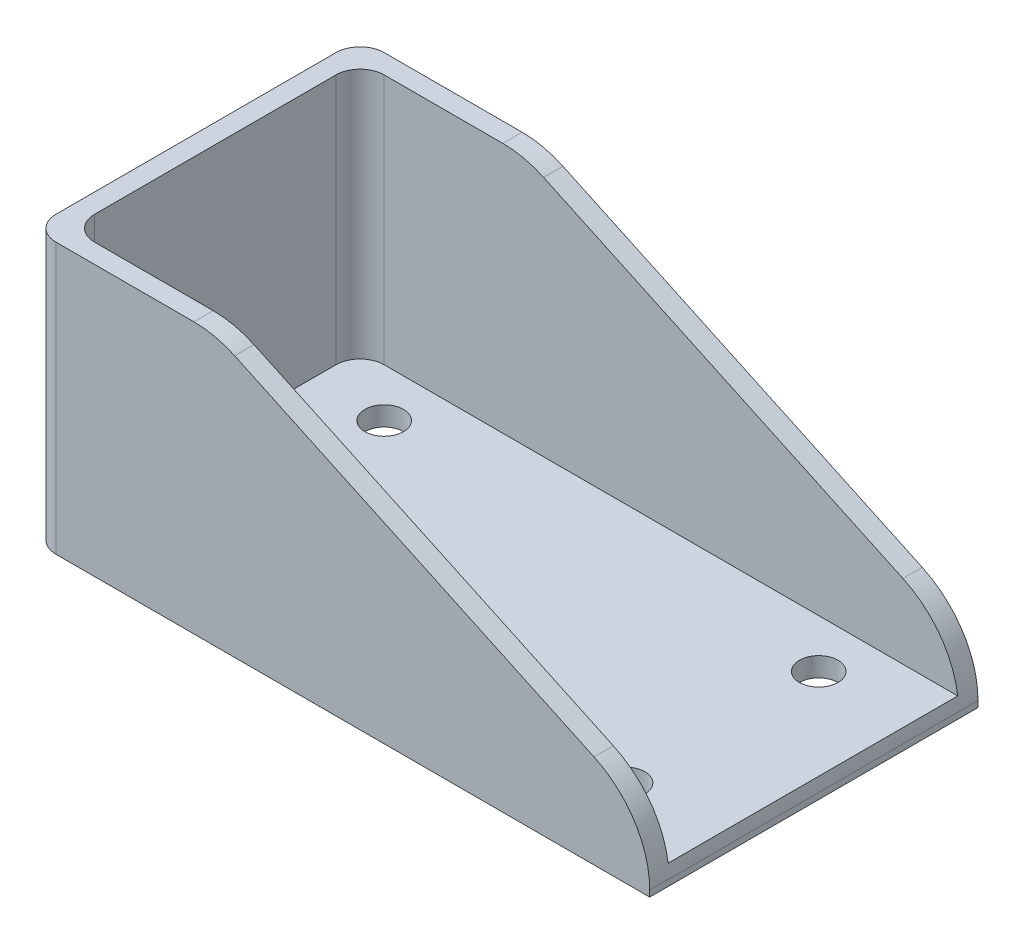
ISO-10303-21;
HEADER;
FILE_DESCRIPTION(('STEP AP214'),'2;1');
FILE_NAME('part.step','',(''),(''),'','','');
FILE_SCHEMA(('AUTOMOTIVE_DESIGN { 1 0 10303 214 1 1 1 1 }'));
ENDSEC;
DATA;
#1=APPLICATION_CONTEXT('core data for automotive mechanical design processes');
#2=APPLICATION_PROTOCOL_DEFINITION('international standard','automotive_design',2000,#1);
#3=PRODUCT_CONTEXT('',#1,'mechanical');
#4=PRODUCT('Part','Part','',(#3));
#5=PRODUCT_RELATED_PRODUCT_CATEGORY('part','',(#4));
#6=PRODUCT_DEFINITION_FORMATION('','',#4);
#7=PRODUCT_DEFINITION_CONTEXT('part definition',#1,'design');
#8=PRODUCT_DEFINITION('design','',#6,#7);
#9=PRODUCT_DEFINITION_SHAPE('','',#8);
#10=(LENGTH_UNIT() NAMED_UNIT(*) SI_UNIT(.MILLI.,.METRE.));
#11=(NAMED_UNIT(*) PLANE_ANGLE_UNIT() SI_UNIT($,.RADIAN.));
#12=(NAMED_UNIT(*) SI_UNIT($,.STERADIAN.) SOLID_ANGLE_UNIT());
#13=UNCERTAINTY_MEASURE_WITH_UNIT(LENGTH_MEASURE(1.E-05),#10,'distance_accuracy_value','');
#14=(GEOMETRIC_REPRESENTATION_CONTEXT(3) GLOBAL_UNCERTAINTY_ASSIGNED_CONTEXT((#13)) GLOBAL_UNIT_ASSIGNED_CONTEXT((#10,
#11,#12)) REPRESENTATION_CONTEXT('',''));
#15=CARTESIAN_POINT('',(0.,0.,0.));
#16=DIRECTION('',(0.,0.,1.));
#17=DIRECTION('',(1.,0.,0.));
#18=AXIS2_PLACEMENT_3D('',#15,#16,#17);
#19=CARTESIAN_POINT('',(8.4051094890511,18.0109489051095,-17.));
#20=DIRECTION('',(0.422885465331124,0.906183139995265,0.));
#21=DIRECTION('',(-0.906183139995265,0.422885465331124,0.));
#22=AXIS2_PLACEMENT_3D('',#19,#20,#21);
#23=PLANE('',#22);
#24=DIRECTION('',(0.906183139995265,-0.422885465331124,0.));
#25=VECTOR('',#24,1.);
#26=CARTESIAN_POINT('',(22.3102189781022,11.521897810219,17.));
#27=LINE('',#26,#25);
#28=CARTESIAN_POINT('',(-10.9896387141843,27.0618313999527,17.));
#29=VERTEX_POINT('',#28);
#30=CARTESIAN_POINT('',(26.2288546533112,9.69320116178809,17.));
#31=VERTEX_POINT('',#30);
#32=EDGE_CURVE('E325',#29,#31,#27,.T.);
#33=ORIENTED_EDGE('',*,*,#32,.T.);
#34=DIRECTION('',(0.,0.,1.));
#35=VECTOR('',#34,1.);
#36=CARTESIAN_POINT('',(26.2288546533112,9.69320116178809,-17.));
#37=LINE('',#36,#35);
#38=CARTESIAN_POINT('',(26.2288546533112,9.69320116178809,15.));
#39=VERTEX_POINT('',#38);
#40=EDGE_CURVE('E378',#31,#39,#37,.F.);
#41=ORIENTED_EDGE('',*,*,#40,.T.);
#42=DIRECTION('',(0.906183139995265,-0.422885465331124,0.));
#43=VECTOR('',#42,1.);
#44=CARTESIAN_POINT('',(22.3102189781022,11.521897810219,15.));
#45=LINE('',#44,#43);
#46=CARTESIAN_POINT('',(-10.9896387141843,27.0618313999527,15.));
#47=VERTEX_POINT('',#46);
#48=EDGE_CURVE('E328',#47,#39,#45,.T.);
#49=ORIENTED_EDGE('',*,*,#48,.F.);
#50=DIRECTION('',(0.,0.,1.));
#51=VECTOR('',#50,1.);
#52=CARTESIAN_POINT('',(-10.9896387141843,27.0618313999527,-17.));
#53=LINE('',#52,#51);
#54=EDGE_CURVE('E382',#47,#29,#53,.T.);
#55=ORIENTED_EDGE('',*,*,#54,.T.);
#56=EDGE_LOOP('',(#33,#41,#49,#55));
#57=FACE_BOUND('',#56,.T.);
#58=ADVANCED_FACE('F57',(#57),#23,.T.);
#59=CARTESIAN_POINT('',(0.,28.,0.));
#60=DIRECTION('',(0.,1.,0.));
#61=DIRECTION('',(0.,0.,1.));
#62=AXIS2_PLACEMENT_3D('',#59,#60,#61);
#63=PLANE('',#62);
#64=DIRECTION('',(1.,0.,0.));
#65=VECTOR('',#64,1.);
#66=CARTESIAN_POINT('',(30.,28.,17.));
#67=LINE('',#66,#65);
#68=CARTESIAN_POINT('',(-29.5,28.,17.));
#69=VERTEX_POINT('',#68);
#70=CARTESIAN_POINT('',(-15.2184933674955,28.,17.));
#71=VERTEX_POINT('',#70);
#72=EDGE_CURVE('E258',#69,#71,#67,.T.);
#73=ORIENTED_EDGE('',*,*,#72,.T.);
#74=DIRECTION('',(0.,0.,1.));
#75=VECTOR('',#74,1.);
#76=CARTESIAN_POINT('',(-15.2184933674955,28.,0.));
#77=LINE('',#76,#75);
#78=CARTESIAN_POINT('',(-15.2184933674955,28.,15.));
#79=VERTEX_POINT('',#78);
#80=EDGE_CURVE('E66',#71,#79,#77,.F.);
#81=ORIENTED_EDGE('',*,*,#80,.T.);
#82=DIRECTION('',(1.,0.,0.));
#83=VECTOR('',#82,1.);
#84=CARTESIAN_POINT('',(30.,28.,15.));
#85=LINE('',#84,#83);
#86=CARTESIAN_POINT('',(-27.5,28.,15.));
#87=VERTEX_POINT('',#86);
#88=EDGE_CURVE('E334',#87,#79,#85,.T.);
#89=ORIENTED_EDGE('',*,*,#88,.F.);
#90=CARTESIAN_POINT('',(-27.5,28.,12.5));
#91=DIRECTION('',(0.,1.,0.));
#92=DIRECTION('',(0.,0.,1.));
#93=AXIS2_PLACEMENT_3D('',#90,#91,#92);
#94=CIRCLE('',#93,2.5);
#95=CARTESIAN_POINT('',(-30.,28.,12.5));
#96=VERTEX_POINT('',#95);
#97=EDGE_CURVE('E249',#87,#96,#94,.F.);
#98=ORIENTED_EDGE('',*,*,#97,.T.);
#99=DIRECTION('',(0.,0.,1.));
#100=VECTOR('',#99,1.);
#101=CARTESIAN_POINT('',(-30.,28.,15.));
#102=LINE('',#101,#100);
#103=CARTESIAN_POINT('',(-30.,28.,-12.5));
#104=VERTEX_POINT('',#103);
#105=EDGE_CURVE('E187',#104,#96,#102,.T.);
#106=ORIENTED_EDGE('',*,*,#105,.F.);
#107=CARTESIAN_POINT('',(-27.5,28.,-12.5));
#108=DIRECTION('',(0.,1.,0.));
#109=DIRECTION('',(0.,0.,1.));
#110=AXIS2_PLACEMENT_3D('',#107,#108,#109);
#111=CIRCLE('',#110,2.5);
#112=CARTESIAN_POINT('',(-27.5,28.,-15.));
#113=VERTEX_POINT('',#112);
#114=EDGE_CURVE('E254',#104,#113,#111,.F.);
#115=ORIENTED_EDGE('',*,*,#114,.T.);
#116=DIRECTION('',(-1.,0.,0.));
#117=VECTOR('',#116,1.);
#118=CARTESIAN_POINT('',(30.,28.,-15.));
#119=LINE('',#118,#117);
#120=CARTESIAN_POINT('',(-15.2184933674955,28.,-15.));
#121=VERTEX_POINT('',#120);
#122=EDGE_CURVE('E274',#121,#113,#119,.T.);
#123=ORIENTED_EDGE('',*,*,#122,.F.);
#124=DIRECTION('',(0.,0.,1.));
#125=VECTOR('',#124,1.);
#126=CARTESIAN_POINT('',(-15.2184933674955,28.,0.));
#127=LINE('',#126,#125);
#128=CARTESIAN_POINT('',(-15.2184933674955,28.,-17.));
#129=VERTEX_POINT('',#128);
#130=EDGE_CURVE('E81',#121,#129,#127,.F.);
#131=ORIENTED_EDGE('',*,*,#130,.T.);
#132=DIRECTION('',(-1.,0.,0.));
#133=VECTOR('',#132,1.);
#134=CARTESIAN_POINT('',(30.,28.,-17.));
#135=LINE('',#134,#133);
#136=CARTESIAN_POINT('',(-29.5,28.,-17.));
#137=VERTEX_POINT('',#136);
#138=EDGE_CURVE('E261',#129,#137,#135,.T.);
#139=ORIENTED_EDGE('',*,*,#138,.T.);
#140=CARTESIAN_POINT('',(-29.5,28.,-14.5));
#141=DIRECTION('',(0.,1.,0.));
#142=DIRECTION('',(0.,0.,1.));
#143=AXIS2_PLACEMENT_3D('',#140,#141,#142);
#144=CIRCLE('',#143,2.5);
#145=CARTESIAN_POINT('',(-32.,28.,-14.5));
#146=VERTEX_POINT('',#145);
#147=EDGE_CURVE('E310',#137,#146,#144,.T.);
#148=ORIENTED_EDGE('',*,*,#147,.T.);
#149=DIRECTION('',(0.,0.,1.));
#150=VECTOR('',#149,1.);
#151=CARTESIAN_POINT('',(-32.,28.,15.));
#152=LINE('',#151,#150);
#153=CARTESIAN_POINT('',(-32.,28.,14.5));
#154=VERTEX_POINT('',#153);
#155=EDGE_CURVE('E262',#146,#154,#152,.T.);
#156=ORIENTED_EDGE('',*,*,#155,.T.);
#157=CARTESIAN_POINT('',(-29.5,28.,14.5));
#158=DIRECTION('',(0.,1.,0.));
#159=DIRECTION('',(0.,0.,1.));
#160=AXIS2_PLACEMENT_3D('',#157,#158,#159);
#161=CIRCLE('',#160,2.5);
#162=EDGE_CURVE('E312',#154,#69,#161,.T.);
#163=ORIENTED_EDGE('',*,*,#162,.T.);
#164=EDGE_LOOP('',(#73,#81,#89,#98,#106,#115,#123,#131,#139,#148,#156,#163));
#165=FACE_BOUND('',#164,.T.);
#166=ADVANCED_FACE('F220',(#165),#63,.T.);
#167=CARTESIAN_POINT('',(30.,28.,17.));
#168=DIRECTION('',(0.,0.,-1.));
#169=DIRECTION('',(-1.,0.,0.));
#170=AXIS2_PLACEMENT_3D('',#167,#168,#169);
#171=PLANE('',#170);
#172=DIRECTION('',(0.,-1.,0.));
#173=VECTOR('',#172,1.);
#174=CARTESIAN_POINT('',(32.,28.,17.));
#175=LINE('',#174,#173);
#176=CARTESIAN_POINT('',(32.,0.631369761835438,17.));
#177=VERTEX_POINT('',#176);
#178=CARTESIAN_POINT('',(32.,0.,17.));
#179=VERTEX_POINT('',#178);
#180=EDGE_CURVE('E284',#177,#179,#175,.T.);
#181=ORIENTED_EDGE('',*,*,#180,.F.);
#182=CARTESIAN_POINT('',(22.,0.631369761835438,17.));
#183=DIRECTION('',(0.,0.,-1.));
#184=DIRECTION('',(-1.,0.,0.));
#185=AXIS2_PLACEMENT_3D('',#182,#183,#184);
#186=CIRCLE('',#185,10.);
#187=EDGE_CURVE('E380',#177,#31,#186,.F.);
#188=ORIENTED_EDGE('',*,*,#187,.T.);
#189=ORIENTED_EDGE('',*,*,#32,.F.);
#190=CARTESIAN_POINT('',(-15.2184933674955,18.,17.));
#191=DIRECTION('',(0.,0.,-1.));
#192=DIRECTION('',(-1.,0.,0.));
#193=AXIS2_PLACEMENT_3D('',#190,#191,#192);
#194=CIRCLE('',#193,10.);
#195=EDGE_CURVE('E252',#29,#71,#194,.F.);
#196=ORIENTED_EDGE('',*,*,#195,.T.);
#197=ORIENTED_EDGE('',*,*,#72,.F.);
#198=DIRECTION('',(0.,-1.,0.));
#199=VECTOR('',#198,1.);
#200=CARTESIAN_POINT('',(-29.5,28.,17.));
#201=LINE('',#200,#199);
#202=CARTESIAN_POINT('',(-29.5,0.,17.));
#203=VERTEX_POINT('',#202);
#204=EDGE_CURVE('E298',#69,#203,#201,.T.);
#205=ORIENTED_EDGE('',*,*,#204,.T.);
#206=DIRECTION('',(1.,0.,0.));
#207=VECTOR('',#206,1.);
#208=CARTESIAN_POINT('',(30.,0.,17.));
#209=LINE('',#208,#207);
#210=EDGE_CURVE('E273',#203,#179,#209,.T.);
#211=ORIENTED_EDGE('',*,*,#210,.T.);
#212=EDGE_LOOP('',(#181,#188,#189,#196,#197,#205,#211));
#213=FACE_BOUND('',#212,.T.);
#214=ADVANCED_FACE('F226',(#213),#171,.F.);
#215=CARTESIAN_POINT('',(32.,28.,15.));
#216=DIRECTION('',(-1.,0.,0.));
#217=DIRECTION('',(0.,0.,1.));
#218=AXIS2_PLACEMENT_3D('',#215,#216,#217);
#219=PLANE('',#218);
#220=DIRECTION('',(0.,-1.,0.));
#221=VECTOR('',#220,1.);
#222=CARTESIAN_POINT('',(32.,28.,-17.));
#223=LINE('',#222,#221);
#224=CARTESIAN_POINT('',(32.,0.631369761835438,-17.));
#225=VERTEX_POINT('',#224);
#226=CARTESIAN_POINT('',(32.,0.,-17.));
#227=VERTEX_POINT('',#226);
#228=EDGE_CURVE('E269',#225,#227,#223,.T.);
#229=ORIENTED_EDGE('',*,*,#228,.F.);
#230=DIRECTION('',(0.,0.,1.));
#231=VECTOR('',#230,1.);
#232=CARTESIAN_POINT('',(32.,0.631369761835438,17.));
#233=LINE('',#232,#231);
#234=EDGE_CURVE('E248',#225,#177,#233,.T.);
#235=ORIENTED_EDGE('',*,*,#234,.T.);
#236=ORIENTED_EDGE('',*,*,#180,.T.);
#237=DIRECTION('',(0.,0.,-1.));
#238=VECTOR('',#237,1.);
#239=CARTESIAN_POINT('',(32.,0.,15.));
#240=LINE('',#239,#238);
#241=EDGE_CURVE('E277',#179,#227,#240,.T.);
#242=ORIENTED_EDGE('',*,*,#241,.T.);
#243=EDGE_LOOP('',(#229,#235,#236,#242));
#244=FACE_BOUND('',#243,.T.);
#245=ADVANCED_FACE('F416',(#244),#219,.F.);
#246=CARTESIAN_POINT('',(30.,28.,-17.));
#247=DIRECTION('',(0.,0.,1.));
#248=DIRECTION('',(1.,0.,0.));
#249=AXIS2_PLACEMENT_3D('',#246,#247,#248);
#250=PLANE('',#249);
#251=DIRECTION('',(-0.906183139995265,0.422885465331124,0.));
#252=VECTOR('',#251,1.);
#253=CARTESIAN_POINT('',(8.4051094890511,18.0109489051095,-17.));
#254=LINE('',#253,#252);
#255=CARTESIAN_POINT('',(26.2288546533112,9.69320116178809,-17.));
#256=VERTEX_POINT('',#255);
#257=CARTESIAN_POINT('',(-10.9896387141843,27.0618313999527,-17.));
#258=VERTEX_POINT('',#257);
#259=EDGE_CURVE('E351',#256,#258,#254,.T.);
#260=ORIENTED_EDGE('',*,*,#259,.F.);
#261=CARTESIAN_POINT('',(22.,0.631369761835438,-17.));
#262=DIRECTION('',(0.,0.,1.));
#263=DIRECTION('',(1.,0.,0.));
#264=AXIS2_PLACEMENT_3D('',#261,#262,#263);
#265=CIRCLE('',#264,10.);
#266=EDGE_CURVE('E344',#256,#225,#265,.F.);
#267=ORIENTED_EDGE('',*,*,#266,.T.);
#268=ORIENTED_EDGE('',*,*,#228,.T.);
#269=DIRECTION('',(-1.,0.,0.));
#270=VECTOR('',#269,1.);
#271=CARTESIAN_POINT('',(30.,0.,-17.));
#272=LINE('',#271,#270);
#273=CARTESIAN_POINT('',(-29.5,0.,-17.));
#274=VERTEX_POINT('',#273);
#275=EDGE_CURVE('E280',#227,#274,#272,.T.);
#276=ORIENTED_EDGE('',*,*,#275,.T.);
#277=DIRECTION('',(0.,-1.,0.));
#278=VECTOR('',#277,1.);
#279=CARTESIAN_POINT('',(-29.5,28.,-17.));
#280=LINE('',#279,#278);
#281=EDGE_CURVE('E314',#274,#137,#280,.F.);
#282=ORIENTED_EDGE('',*,*,#281,.T.);
#283=ORIENTED_EDGE('',*,*,#138,.F.);
#284=CARTESIAN_POINT('',(-15.2184933674955,18.,-17.));
#285=DIRECTION('',(0.,0.,1.));
#286=DIRECTION('',(1.,0.,0.));
#287=AXIS2_PLACEMENT_3D('',#284,#285,#286);
#288=CIRCLE('',#287,10.);
#289=EDGE_CURVE('E196',#129,#258,#288,.F.);
#290=ORIENTED_EDGE('',*,*,#289,.T.);
#291=EDGE_LOOP('',(#260,#267,#268,#276,#282,#283,#290));
#292=FACE_BOUND('',#291,.T.);
#293=ADVANCED_FACE('F419',(#292),#250,.F.);
#294=CARTESIAN_POINT('',(30.,28.,15.));
#295=DIRECTION('',(0.,0.,-1.));
#296=DIRECTION('',(-1.,0.,0.));
#297=AXIS2_PLACEMENT_3D('',#294,#295,#296);
#298=PLANE('',#297);
#299=ORIENTED_EDGE('',*,*,#48,.T.);
#300=CARTESIAN_POINT('',(22.,0.631369761835438,15.));
#301=DIRECTION('',(0.,0.,-1.));
#302=DIRECTION('',(-1.,0.,0.));
#303=AXIS2_PLACEMENT_3D('',#300,#301,#302);
#304=CIRCLE('',#303,10.);
#305=CARTESIAN_POINT('',(31.9058998213782,2.00000000000001,15.));
#306=VERTEX_POINT('',#305);
#307=EDGE_CURVE('E337',#39,#306,#304,.T.);
#308=ORIENTED_EDGE('',*,*,#307,.T.);
#309=DIRECTION('',(1.,0.,0.));
#310=VECTOR('',#309,1.);
#311=CARTESIAN_POINT('',(30.,2.,15.));
#312=LINE('',#311,#310);
#313=CARTESIAN_POINT('',(-27.5,2.,15.));
#314=VERTEX_POINT('',#313);
#315=EDGE_CURVE('E73',#314,#306,#312,.T.);
#316=ORIENTED_EDGE('',*,*,#315,.F.);
#317=DIRECTION('',(0.,-1.,0.));
#318=VECTOR('',#317,1.);
#319=CARTESIAN_POINT('',(-27.5,28.,15.));
#320=LINE('',#319,#318);
#321=EDGE_CURVE('E296',#314,#87,#320,.F.);
#322=ORIENTED_EDGE('',*,*,#321,.T.);
#323=ORIENTED_EDGE('',*,*,#88,.T.);
#324=CARTESIAN_POINT('',(-15.2184933674955,18.,15.));
#325=DIRECTION('',(0.,0.,-1.));
#326=DIRECTION('',(-1.,0.,0.));
#327=AXIS2_PLACEMENT_3D('',#324,#325,#326);
#328=CIRCLE('',#327,10.);
#329=EDGE_CURVE('E339',#79,#47,#328,.T.);
#330=ORIENTED_EDGE('',*,*,#329,.T.);
#331=EDGE_LOOP('',(#299,#308,#316,#322,#323,#330));
#332=FACE_BOUND('',#331,.T.);
#333=ADVANCED_FACE('F373',(#332),#298,.T.);
#334=CARTESIAN_POINT('',(30.,28.,-15.));
#335=DIRECTION('',(0.,0.,1.));
#336=DIRECTION('',(1.,0.,0.));
#337=AXIS2_PLACEMENT_3D('',#334,#335,#336);
#338=PLANE('',#337);
#339=DIRECTION('',(-1.,0.,0.));
#340=VECTOR('',#339,1.);
#341=CARTESIAN_POINT('',(30.,2.,-15.));
#342=LINE('',#341,#340);
#343=CARTESIAN_POINT('',(31.9058998213782,2.00000000000001,-15.));
#344=VERTEX_POINT('',#343);
#345=CARTESIAN_POINT('',(-27.5,2.,-15.));
#346=VERTEX_POINT('',#345);
#347=EDGE_CURVE('E179',#344,#346,#342,.T.);
#348=ORIENTED_EDGE('',*,*,#347,.F.);
#349=CARTESIAN_POINT('',(22.,0.631369761835438,-15.));
#350=DIRECTION('',(0.,0.,1.));
#351=DIRECTION('',(1.,0.,0.));
#352=AXIS2_PLACEMENT_3D('',#349,#350,#351);
#353=CIRCLE('',#352,10.);
#354=CARTESIAN_POINT('',(26.2288546533112,9.69320116178809,-15.));
#355=VERTEX_POINT('',#354);
#356=EDGE_CURVE('E183',#344,#355,#353,.T.);
#357=ORIENTED_EDGE('',*,*,#356,.T.);
#358=DIRECTION('',(-0.906183139995265,0.422885465331124,0.));
#359=VECTOR('',#358,1.);
#360=CARTESIAN_POINT('',(22.3102189781022,11.521897810219,-15.));
#361=LINE('',#360,#359);
#362=CARTESIAN_POINT('',(-10.9896387141843,27.0618313999527,-15.));
#363=VERTEX_POINT('',#362);
#364=EDGE_CURVE('E243',#355,#363,#361,.T.);
#365=ORIENTED_EDGE('',*,*,#364,.T.);
#366=CARTESIAN_POINT('',(-15.2184933674955,18.,-15.));
#367=DIRECTION('',(0.,0.,1.));
#368=DIRECTION('',(1.,0.,0.));
#369=AXIS2_PLACEMENT_3D('',#366,#367,#368);
#370=CIRCLE('',#369,10.);
#371=EDGE_CURVE('E197',#363,#121,#370,.T.);
#372=ORIENTED_EDGE('',*,*,#371,.T.);
#373=ORIENTED_EDGE('',*,*,#122,.T.);
#374=DIRECTION('',(0.,-1.,0.));
#375=VECTOR('',#374,1.);
#376=CARTESIAN_POINT('',(-27.5,2.,-15.));
#377=LINE('',#376,#375);
#378=EDGE_CURVE('E186',#113,#346,#377,.T.);
#379=ORIENTED_EDGE('',*,*,#378,.T.);
#380=EDGE_LOOP('',(#348,#357,#365,#372,#373,#379));
#381=FACE_BOUND('',#380,.T.);
#382=ADVANCED_FACE('F181',(#381),#338,.T.);
#383=CARTESIAN_POINT('',(0.,0.,0.));
#384=DIRECTION('',(0.,1.,0.));
#385=DIRECTION('',(0.,0.,1.));
#386=AXIS2_PLACEMENT_3D('',#383,#384,#385);
#387=PLANE('',#386);
#388=CARTESIAN_POINT('',(22.5,0.,-10.));
#389=DIRECTION('',(0.,1.,0.));
#390=DIRECTION('',(0.,0.,1.));
#391=AXIS2_PLACEMENT_3D('',#388,#389,#390);
#392=CIRCLE('',#391,2.);
#393=CARTESIAN_POINT('',(22.5,0.,-8.));
#394=VERTEX_POINT('',#393);
#395=EDGE_CURVE('E356',#394,#394,#392,.T.);
#396=ORIENTED_EDGE('',*,*,#395,.T.);
#397=EDGE_LOOP('',(#396));
#398=FACE_BOUND('',#397,.T.);
#399=CARTESIAN_POINT('',(-22.5,0.,-10.));
#400=DIRECTION('',(0.,1.,0.));
#401=DIRECTION('',(0.,0.,1.));
#402=AXIS2_PLACEMENT_3D('',#399,#400,#401);
#403=CIRCLE('',#402,2.);
#404=CARTESIAN_POINT('',(-22.5,0.,-8.));
#405=VERTEX_POINT('',#404);
#406=EDGE_CURVE('E575',#405,#405,#403,.T.);
#407=ORIENTED_EDGE('',*,*,#406,.T.);
#408=EDGE_LOOP('',(#407));
#409=FACE_BOUND('',#408,.T.);
#410=CARTESIAN_POINT('',(-22.5,0.,10.));
#411=DIRECTION('',(0.,1.,0.));
#412=DIRECTION('',(0.,0.,1.));
#413=AXIS2_PLACEMENT_3D('',#410,#411,#412);
#414=CIRCLE('',#413,2.);
#415=CARTESIAN_POINT('',(-22.5,0.,12.));
#416=VERTEX_POINT('',#415);
#417=EDGE_CURVE('E368',#416,#416,#414,.T.);
#418=ORIENTED_EDGE('',*,*,#417,.T.);
#419=EDGE_LOOP('',(#418));
#420=FACE_BOUND('',#419,.T.);
#421=CARTESIAN_POINT('',(22.5,0.,10.));
#422=DIRECTION('',(0.,1.,0.));
#423=DIRECTION('',(0.,0.,1.));
#424=AXIS2_PLACEMENT_3D('',#421,#422,#423);
#425=CIRCLE('',#424,2.);
#426=CARTESIAN_POINT('',(22.5,0.,12.));
#427=VERTEX_POINT('',#426);
#428=EDGE_CURVE('E352',#427,#427,#425,.T.);
#429=ORIENTED_EDGE('',*,*,#428,.T.);
#430=EDGE_LOOP('',(#429));
#431=FACE_BOUND('',#430,.T.);
#432=ORIENTED_EDGE('',*,*,#210,.F.);
#433=CARTESIAN_POINT('',(-29.5,0.,14.5));
#434=DIRECTION('',(0.,1.,0.));
#435=DIRECTION('',(0.,0.,1.));
#436=AXIS2_PLACEMENT_3D('',#433,#434,#435);
#437=CIRCLE('',#436,2.5);
#438=CARTESIAN_POINT('',(-32.,0.,14.5));
#439=VERTEX_POINT('',#438);
#440=EDGE_CURVE('E303',#203,#439,#437,.F.);
#441=ORIENTED_EDGE('',*,*,#440,.T.);
#442=DIRECTION('',(0.,0.,1.));
#443=VECTOR('',#442,1.);
#444=CARTESIAN_POINT('',(-32.,0.,15.));
#445=LINE('',#444,#443);
#446=CARTESIAN_POINT('',(-32.,0.,-14.5));
#447=VERTEX_POINT('',#446);
#448=EDGE_CURVE('E270',#447,#439,#445,.T.);
#449=ORIENTED_EDGE('',*,*,#448,.F.);
#450=CARTESIAN_POINT('',(-29.5,0.,-14.5));
#451=DIRECTION('',(0.,1.,0.));
#452=DIRECTION('',(0.,0.,1.));
#453=AXIS2_PLACEMENT_3D('',#450,#451,#452);
#454=CIRCLE('',#453,2.5);
#455=EDGE_CURVE('E301',#447,#274,#454,.F.);
#456=ORIENTED_EDGE('',*,*,#455,.T.);
#457=ORIENTED_EDGE('',*,*,#275,.F.);
#458=ORIENTED_EDGE('',*,*,#241,.F.);
#459=EDGE_LOOP('',(#432,#441,#449,#456,#457,#458));
#460=FACE_BOUND('',#459,.T.);
#461=ADVANCED_FACE('F412',(#398,#409,#420,#431,#460),#387,.F.);
#462=CARTESIAN_POINT('',(-32.,28.,15.));
#463=DIRECTION('',(1.,0.,0.));
#464=DIRECTION('',(0.,0.,-1.));
#465=AXIS2_PLACEMENT_3D('',#462,#463,#464);
#466=PLANE('',#465);
#467=ORIENTED_EDGE('',*,*,#448,.T.);
#468=DIRECTION('',(0.,-1.,0.));
#469=VECTOR('',#468,1.);
#470=CARTESIAN_POINT('',(-32.,28.,14.5));
#471=LINE('',#470,#469);
#472=EDGE_CURVE('E308',#439,#154,#471,.F.);
#473=ORIENTED_EDGE('',*,*,#472,.T.);
#474=ORIENTED_EDGE('',*,*,#155,.F.);
#475=DIRECTION('',(0.,-1.,0.));
#476=VECTOR('',#475,1.);
#477=CARTESIAN_POINT('',(-32.,28.,-14.5));
#478=LINE('',#477,#476);
#479=EDGE_CURVE('E305',#146,#447,#478,.T.);
#480=ORIENTED_EDGE('',*,*,#479,.T.);
#481=EDGE_LOOP('',(#467,#473,#474,#480));
#482=FACE_BOUND('',#481,.T.);
#483=ADVANCED_FACE('F212',(#482),#466,.F.);
#484=CARTESIAN_POINT('',(-30.,28.,15.));
#485=DIRECTION('',(1.,0.,0.));
#486=DIRECTION('',(0.,0.,-1.));
#487=AXIS2_PLACEMENT_3D('',#484,#485,#486);
#488=PLANE('',#487);
#489=DIRECTION('',(0.,0.,1.));
#490=VECTOR('',#489,1.);
#491=CARTESIAN_POINT('',(-30.,2.,15.));
#492=LINE('',#491,#490);
#493=CARTESIAN_POINT('',(-30.,2.,-12.5));
#494=VERTEX_POINT('',#493);
#495=CARTESIAN_POINT('',(-30.,2.,12.5));
#496=VERTEX_POINT('',#495);
#497=EDGE_CURVE('E323',#494,#496,#492,.T.);
#498=ORIENTED_EDGE('',*,*,#497,.F.);
#499=DIRECTION('',(0.,-1.,0.));
#500=VECTOR('',#499,1.);
#501=CARTESIAN_POINT('',(-30.,28.,-12.5));
#502=LINE('',#501,#500);
#503=EDGE_CURVE('E294',#494,#104,#502,.F.);
#504=ORIENTED_EDGE('',*,*,#503,.T.);
#505=ORIENTED_EDGE('',*,*,#105,.T.);
#506=DIRECTION('',(0.,-1.,0.));
#507=VECTOR('',#506,1.);
#508=CARTESIAN_POINT('',(-30.,2.,12.5));
#509=LINE('',#508,#507);
#510=EDGE_CURVE('E291',#96,#496,#509,.T.);
#511=ORIENTED_EDGE('',*,*,#510,.T.);
#512=EDGE_LOOP('',(#498,#504,#505,#511));
#513=FACE_BOUND('',#512,.T.);
#514=ADVANCED_FACE('F202',(#513),#488,.T.);
#515=CARTESIAN_POINT('',(0.,2.,0.));
#516=DIRECTION('',(0.,1.,0.));
#517=DIRECTION('',(0.,0.,1.));
#518=AXIS2_PLACEMENT_3D('',#515,#516,#517);
#519=PLANE('',#518);
#520=CARTESIAN_POINT('',(22.5,2.,-10.));
#521=DIRECTION('',(0.,1.,0.));
#522=DIRECTION('',(0.,0.,1.));
#523=AXIS2_PLACEMENT_3D('',#520,#521,#522);
#524=CIRCLE('',#523,2.);
#525=CARTESIAN_POINT('',(22.5,2.,-8.));
#526=VERTEX_POINT('',#525);
#527=EDGE_CURVE('E61',#526,#526,#524,.T.);
#528=ORIENTED_EDGE('',*,*,#527,.F.);
#529=EDGE_LOOP('',(#528));
#530=FACE_BOUND('',#529,.T.);
#531=CARTESIAN_POINT('',(-22.5,2.,-10.));
#532=DIRECTION('',(0.,1.,0.));
#533=DIRECTION('',(0.,0.,1.));
#534=AXIS2_PLACEMENT_3D('',#531,#532,#533);
#535=CIRCLE('',#534,2.);
#536=CARTESIAN_POINT('',(-22.5,2.,-8.));
#537=VERTEX_POINT('',#536);
#538=EDGE_CURVE('E355',#537,#537,#535,.T.);
#539=ORIENTED_EDGE('',*,*,#538,.F.);
#540=EDGE_LOOP('',(#539));
#541=FACE_BOUND('',#540,.T.);
#542=CARTESIAN_POINT('',(-22.5,2.,10.));
#543=DIRECTION('',(0.,1.,0.));
#544=DIRECTION('',(0.,0.,1.));
#545=AXIS2_PLACEMENT_3D('',#542,#543,#544);
#546=CIRCLE('',#545,2.);
#547=CARTESIAN_POINT('',(-22.5,2.,12.));
#548=VERTEX_POINT('',#547);
#549=EDGE_CURVE('E353',#548,#548,#546,.T.);
#550=ORIENTED_EDGE('',*,*,#549,.F.);
#551=EDGE_LOOP('',(#550));
#552=FACE_BOUND('',#551,.T.);
#553=CARTESIAN_POINT('',(22.5,2.,10.));
#554=DIRECTION('',(0.,1.,0.));
#555=DIRECTION('',(0.,0.,1.));
#556=AXIS2_PLACEMENT_3D('',#553,#554,#555);
#557=CIRCLE('',#556,2.);
#558=CARTESIAN_POINT('',(22.5,2.,12.));
#559=VERTEX_POINT('',#558);
#560=EDGE_CURVE('E348',#559,#559,#557,.T.);
#561=ORIENTED_EDGE('',*,*,#560,.F.);
#562=EDGE_LOOP('',(#561));
#563=FACE_BOUND('',#562,.T.);
#564=ORIENTED_EDGE('',*,*,#347,.T.);
#565=CARTESIAN_POINT('',(-27.5,2.,-12.5));
#566=DIRECTION('',(0.,1.,0.));
#567=DIRECTION('',(0.,0.,1.));
#568=AXIS2_PLACEMENT_3D('',#565,#566,#567);
#569=CIRCLE('',#568,2.5);
#570=EDGE_CURVE('E289',#346,#494,#569,.T.);
#571=ORIENTED_EDGE('',*,*,#570,.T.);
#572=ORIENTED_EDGE('',*,*,#497,.T.);
#573=CARTESIAN_POINT('',(-27.5,2.,12.5));
#574=DIRECTION('',(0.,1.,0.));
#575=DIRECTION('',(0.,0.,1.));
#576=AXIS2_PLACEMENT_3D('',#573,#574,#575);
#577=CIRCLE('',#576,2.5);
#578=EDGE_CURVE('E287',#496,#314,#577,.T.);
#579=ORIENTED_EDGE('',*,*,#578,.T.);
#580=ORIENTED_EDGE('',*,*,#315,.T.);
#581=DIRECTION('',(0.,0.,-1.));
#582=VECTOR('',#581,1.);
#583=CARTESIAN_POINT('',(31.9058998213782,2.00000000000001,15.));
#584=LINE('',#583,#582);
#585=EDGE_CURVE('E12',#306,#344,#584,.T.);
#586=ORIENTED_EDGE('',*,*,#585,.T.);
#587=EDGE_LOOP('',(#564,#571,#572,#579,#580,#586));
#588=FACE_BOUND('',#587,.T.);
#589=ADVANCED_FACE('F199',(#530,#541,#552,#563,#588),#519,.T.);
#590=CARTESIAN_POINT('',(-27.5,28.,-12.5));
#591=DIRECTION('',(0.,1.,0.));
#592=DIRECTION('',(0.,0.,1.));
#593=AXIS2_PLACEMENT_3D('',#590,#591,#592);
#594=CYLINDRICAL_SURFACE('',#593,2.5);
#595=ORIENTED_EDGE('',*,*,#114,.F.);
#596=ORIENTED_EDGE('',*,*,#503,.F.);
#597=ORIENTED_EDGE('',*,*,#570,.F.);
#598=ORIENTED_EDGE('',*,*,#378,.F.);
#599=EDGE_LOOP('',(#595,#596,#597,#598));
#600=FACE_BOUND('',#599,.T.);
#601=ADVANCED_FACE('F201',(#600),#594,.F.);
#602=CARTESIAN_POINT('',(-27.5,28.,12.5));
#603=DIRECTION('',(0.,1.,0.));
#604=DIRECTION('',(0.,0.,1.));
#605=AXIS2_PLACEMENT_3D('',#602,#603,#604);
#606=CYLINDRICAL_SURFACE('',#605,2.5);
#607=ORIENTED_EDGE('',*,*,#97,.F.);
#608=ORIENTED_EDGE('',*,*,#321,.F.);
#609=ORIENTED_EDGE('',*,*,#578,.F.);
#610=ORIENTED_EDGE('',*,*,#510,.F.);
#611=EDGE_LOOP('',(#607,#608,#609,#610));
#612=FACE_BOUND('',#611,.T.);
#613=ADVANCED_FACE('F209',(#612),#606,.F.);
#614=CARTESIAN_POINT('',(-29.5,28.,14.5));
#615=DIRECTION('',(0.,-1.,0.));
#616=DIRECTION('',(0.,0.,-1.));
#617=AXIS2_PLACEMENT_3D('',#614,#615,#616);
#618=CYLINDRICAL_SURFACE('',#617,2.5);
#619=ORIENTED_EDGE('',*,*,#162,.F.);
#620=ORIENTED_EDGE('',*,*,#472,.F.);
#621=ORIENTED_EDGE('',*,*,#440,.F.);
#622=ORIENTED_EDGE('',*,*,#204,.F.);
#623=EDGE_LOOP('',(#619,#620,#621,#622));
#624=FACE_BOUND('',#623,.T.);
#625=ADVANCED_FACE('F239',(#624),#618,.T.);
#626=CARTESIAN_POINT('',(-29.5,28.,-14.5));
#627=DIRECTION('',(0.,-1.,0.));
#628=DIRECTION('',(0.,0.,-1.));
#629=AXIS2_PLACEMENT_3D('',#626,#627,#628);
#630=CYLINDRICAL_SURFACE('',#629,2.5);
#631=ORIENTED_EDGE('',*,*,#147,.F.);
#632=ORIENTED_EDGE('',*,*,#281,.F.);
#633=ORIENTED_EDGE('',*,*,#455,.F.);
#634=ORIENTED_EDGE('',*,*,#479,.F.);
#635=EDGE_LOOP('',(#631,#632,#633,#634));
#636=FACE_BOUND('',#635,.T.);
#637=ADVANCED_FACE('F231',(#636),#630,.T.);
#638=ORIENTED_EDGE('',*,*,#364,.F.);
#639=DIRECTION('',(0.,0.,1.));
#640=VECTOR('',#639,1.);
#641=CARTESIAN_POINT('',(26.2288546533112,9.69320116178809,-17.));
#642=LINE('',#641,#640);
#643=EDGE_CURVE('E195',#355,#256,#642,.F.);
#644=ORIENTED_EDGE('',*,*,#643,.T.);
#645=ORIENTED_EDGE('',*,*,#259,.T.);
#646=DIRECTION('',(0.,0.,1.));
#647=VECTOR('',#646,1.);
#648=CARTESIAN_POINT('',(-10.9896387141843,27.0618313999527,-17.));
#649=LINE('',#648,#647);
#650=EDGE_CURVE('E247',#258,#363,#649,.T.);
#651=ORIENTED_EDGE('',*,*,#650,.T.);
#652=EDGE_LOOP('',(#638,#644,#645,#651));
#653=FACE_BOUND('',#652,.T.);
#654=ADVANCED_FACE('F222',(#653),#23,.T.);
#655=CARTESIAN_POINT('',(22.,0.631369761835438,15.));
#656=DIRECTION('',(0.,0.,-1.));
#657=DIRECTION('',(-1.,0.,0.));
#658=AXIS2_PLACEMENT_3D('',#655,#656,#657);
#659=CYLINDRICAL_SURFACE('',#658,10.);
#660=ORIENTED_EDGE('',*,*,#356,.F.);
#661=ORIENTED_EDGE('',*,*,#585,.F.);
#662=ORIENTED_EDGE('',*,*,#307,.F.);
#663=ORIENTED_EDGE('',*,*,#40,.F.);
#664=ORIENTED_EDGE('',*,*,#187,.F.);
#665=ORIENTED_EDGE('',*,*,#234,.F.);
#666=ORIENTED_EDGE('',*,*,#266,.F.);
#667=ORIENTED_EDGE('',*,*,#643,.F.);
#668=EDGE_LOOP('',(#660,#661,#662,#663,#664,#665,#666,#667));
#669=FACE_BOUND('',#668,.T.);
#670=ADVANCED_FACE('F192',(#669),#659,.T.);
#671=CARTESIAN_POINT('',(-15.2184933674955,18.,-17.));
#672=DIRECTION('',(0.,0.,1.));
#673=DIRECTION('',(1.,0.,0.));
#674=AXIS2_PLACEMENT_3D('',#671,#672,#673);
#675=CYLINDRICAL_SURFACE('',#674,10.);
#676=ORIENTED_EDGE('',*,*,#329,.F.);
#677=ORIENTED_EDGE('',*,*,#80,.F.);
#678=ORIENTED_EDGE('',*,*,#195,.F.);
#679=ORIENTED_EDGE('',*,*,#54,.F.);
#680=EDGE_LOOP('',(#676,#677,#678,#679));
#681=FACE_BOUND('',#680,.T.);
#682=ADVANCED_FACE('F237',(#681),#675,.T.);
#683=CARTESIAN_POINT('',(-15.2184933674955,18.,-17.));
#684=DIRECTION('',(0.,0.,1.));
#685=DIRECTION('',(1.,0.,0.));
#686=AXIS2_PLACEMENT_3D('',#683,#684,#685);
#687=CYLINDRICAL_SURFACE('',#686,10.);
#688=ORIENTED_EDGE('',*,*,#289,.F.);
#689=ORIENTED_EDGE('',*,*,#130,.F.);
#690=ORIENTED_EDGE('',*,*,#371,.F.);
#691=ORIENTED_EDGE('',*,*,#650,.F.);
#692=EDGE_LOOP('',(#688,#689,#690,#691));
#693=FACE_BOUND('',#692,.T.);
#694=ADVANCED_FACE('F59',(#693),#687,.T.);
#695=CARTESIAN_POINT('',(22.5,0.,10.));
#696=DIRECTION('',(0.,1.,0.));
#697=DIRECTION('',(0.,0.,1.));
#698=AXIS2_PLACEMENT_3D('',#695,#696,#697);
#699=CYLINDRICAL_SURFACE('',#698,2.);
#700=ORIENTED_EDGE('',*,*,#560,.T.);
#701=EDGE_LOOP('',(#700));
#702=FACE_BOUND('',#701,.T.);
#703=ORIENTED_EDGE('',*,*,#428,.F.);
#704=EDGE_LOOP('',(#703));
#705=FACE_BOUND('',#704,.T.);
#706=ADVANCED_FACE('F402',(#702,#705),#699,.F.);
#707=CARTESIAN_POINT('',(-22.5,0.,10.));
#708=DIRECTION('',(0.,1.,0.));
#709=DIRECTION('',(0.,0.,1.));
#710=AXIS2_PLACEMENT_3D('',#707,#708,#709);
#711=CYLINDRICAL_SURFACE('',#710,2.);
#712=ORIENTED_EDGE('',*,*,#549,.T.);
#713=EDGE_LOOP('',(#712));
#714=FACE_BOUND('',#713,.T.);
#715=ORIENTED_EDGE('',*,*,#417,.F.);
#716=EDGE_LOOP('',(#715));
#717=FACE_BOUND('',#716,.T.);
#718=ADVANCED_FACE('F542',(#714,#717),#711,.F.);
#719=CARTESIAN_POINT('',(-22.5,0.,-10.));
#720=DIRECTION('',(0.,1.,0.));
#721=DIRECTION('',(0.,0.,1.));
#722=AXIS2_PLACEMENT_3D('',#719,#720,#721);
#723=CYLINDRICAL_SURFACE('',#722,2.);
#724=ORIENTED_EDGE('',*,*,#538,.T.);
#725=EDGE_LOOP('',(#724));
#726=FACE_BOUND('',#725,.T.);
#727=ORIENTED_EDGE('',*,*,#406,.F.);
#728=EDGE_LOOP('',(#727));
#729=FACE_BOUND('',#728,.T.);
#730=ADVANCED_FACE('F550',(#726,#729),#723,.F.);
#731=CARTESIAN_POINT('',(22.5,0.,-10.));
#732=DIRECTION('',(0.,1.,0.));
#733=DIRECTION('',(0.,0.,1.));
#734=AXIS2_PLACEMENT_3D('',#731,#732,#733);
#735=CYLINDRICAL_SURFACE('',#734,2.);
#736=ORIENTED_EDGE('',*,*,#527,.T.);
#737=EDGE_LOOP('',(#736));
#738=FACE_BOUND('',#737,.T.);
#739=ORIENTED_EDGE('',*,*,#395,.F.);
#740=EDGE_LOOP('',(#739));
#741=FACE_BOUND('',#740,.T.);
#742=ADVANCED_FACE('F559',(#738,#741),#735,.F.);
#743=CLOSED_SHELL('',(#58,#166,#214,#245,#293,#333,#382,#461,#483,#514,#589,#601,#613,#625,#637,
#654,#670,#682,#694,#706,#718,#730,#742));
#744=MANIFOLD_SOLID_BREP('B2',#743);
#745=ADVANCED_BREP_SHAPE_REPRESENTATION('',(#18,#744),#14);
#746=SHAPE_DEFINITION_REPRESENTATION(#9,#745);
ENDSEC;
END-ISO-10303-21;
